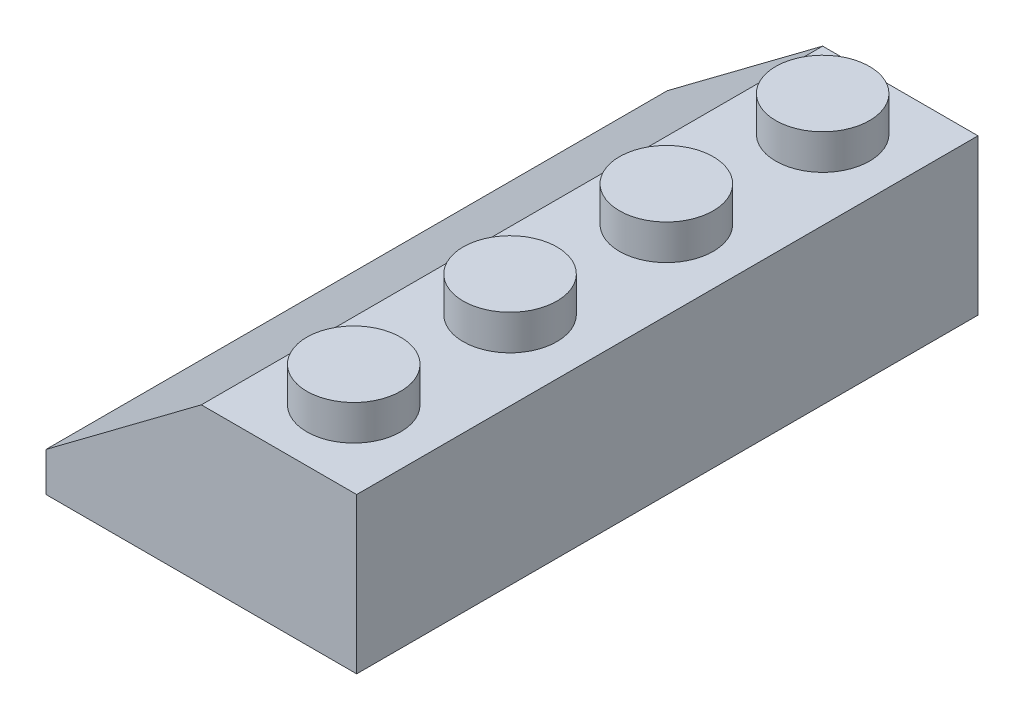
ISO-10303-21;
HEADER;
FILE_DESCRIPTION(('STEP AP214'),'2;1');
FILE_NAME('part.step','',(''),(''),'','','');
FILE_SCHEMA(('AUTOMOTIVE_DESIGN { 1 0 10303 214 1 1 1 1 }'));
ENDSEC;
DATA;
#1=APPLICATION_CONTEXT('core data for automotive mechanical design processes');
#2=APPLICATION_PROTOCOL_DEFINITION('international standard','automotive_design',2000,#1);
#3=PRODUCT_CONTEXT('',#1,'mechanical');
#4=PRODUCT('Part','Part','',(#3));
#5=PRODUCT_RELATED_PRODUCT_CATEGORY('part','',(#4));
#6=PRODUCT_DEFINITION_FORMATION('','',#4);
#7=PRODUCT_DEFINITION_CONTEXT('part definition',#1,'design');
#8=PRODUCT_DEFINITION('design','',#6,#7);
#9=PRODUCT_DEFINITION_SHAPE('','',#8);
#10=(LENGTH_UNIT() NAMED_UNIT(*) SI_UNIT(.MILLI.,.METRE.));
#11=(NAMED_UNIT(*) PLANE_ANGLE_UNIT() SI_UNIT($,.RADIAN.));
#12=(NAMED_UNIT(*) SI_UNIT($,.STERADIAN.) SOLID_ANGLE_UNIT());
#13=UNCERTAINTY_MEASURE_WITH_UNIT(LENGTH_MEASURE(1.E-05),#10,'distance_accuracy_value','');
#14=(GEOMETRIC_REPRESENTATION_CONTEXT(3) GLOBAL_UNCERTAINTY_ASSIGNED_CONTEXT((#13)) GLOBAL_UNIT_ASSIGNED_CONTEXT((#10,
#11,#12)) REPRESENTATION_CONTEXT('',''));
#15=CARTESIAN_POINT('',(0.,0.,0.));
#16=DIRECTION('',(0.,0.,1.));
#17=DIRECTION('',(1.,0.,0.));
#18=AXIS2_PLACEMENT_3D('',#15,#16,#17);
#19=CARTESIAN_POINT('',(0.,0.,-15.9));
#20=DIRECTION('',(0.,-1.,0.));
#21=DIRECTION('',(1.,0.,0.));
#22=AXIS2_PLACEMENT_3D('',#19,#20,#21);
#23=PLANE('',#22);
#24=DIRECTION('',(1.,0.,0.));
#25=VECTOR('',#24,1.);
#26=CARTESIAN_POINT('',(0.,0.,15.9));
#27=LINE('',#26,#25);
#28=CARTESIAN_POINT('',(-15.9,0.,15.9));
#29=VERTEX_POINT('',#28);
#30=CARTESIAN_POINT('',(0.,0.,15.9));
#31=VERTEX_POINT('',#30);
#32=EDGE_CURVE('E274',#29,#31,#27,.T.);
#33=ORIENTED_EDGE('',*,*,#32,.F.);
#34=DIRECTION('',(0.,0.,1.));
#35=VECTOR('',#34,1.);
#36=CARTESIAN_POINT('',(-15.9,0.,-15.9));
#37=LINE('',#36,#35);
#38=CARTESIAN_POINT('',(-15.9,0.,-15.9));
#39=VERTEX_POINT('',#38);
#40=EDGE_CURVE('E313',#39,#29,#37,.T.);
#41=ORIENTED_EDGE('',*,*,#40,.F.);
#42=DIRECTION('',(1.,0.,0.));
#43=VECTOR('',#42,1.);
#44=CARTESIAN_POINT('',(0.,0.,-15.9));
#45=LINE('',#44,#43);
#46=CARTESIAN_POINT('',(0.,0.,-15.9));
#47=VERTEX_POINT('',#46);
#48=EDGE_CURVE('E286',#39,#47,#45,.T.);
#49=ORIENTED_EDGE('',*,*,#48,.T.);
#50=DIRECTION('',(0.,0.,1.));
#51=VECTOR('',#50,1.);
#52=CARTESIAN_POINT('',(0.,0.,-15.9));
#53=LINE('',#52,#51);
#54=EDGE_CURVE('E309',#47,#31,#53,.T.);
#55=ORIENTED_EDGE('',*,*,#54,.T.);
#56=EDGE_LOOP('',(#33,#41,#49,#55));
#57=FACE_BOUND('',#56,.T.);
#58=DIRECTION('',(0.,0.,1.));
#59=VECTOR('',#58,1.);
#60=CARTESIAN_POINT('',(-14.7,0.,-15.9));
#61=LINE('',#60,#59);
#62=CARTESIAN_POINT('',(-14.7,0.,-14.7));
#63=VERTEX_POINT('',#62);
#64=CARTESIAN_POINT('',(-14.7,0.,14.7));
#65=VERTEX_POINT('',#64);
#66=EDGE_CURVE('E231',#63,#65,#61,.T.);
#67=ORIENTED_EDGE('',*,*,#66,.T.);
#68=DIRECTION('',(1.,0.,0.));
#69=VECTOR('',#68,1.);
#70=CARTESIAN_POINT('',(0.,0.,14.7));
#71=LINE('',#70,#69);
#72=CARTESIAN_POINT('',(-1.2,0.,14.7));
#73=VERTEX_POINT('',#72);
#74=EDGE_CURVE('E212',#65,#73,#71,.T.);
#75=ORIENTED_EDGE('',*,*,#74,.T.);
#76=DIRECTION('',(0.,0.,1.));
#77=VECTOR('',#76,1.);
#78=CARTESIAN_POINT('',(-1.2,0.,-15.9));
#79=LINE('',#78,#77);
#80=CARTESIAN_POINT('',(-1.2,0.,-14.7));
#81=VERTEX_POINT('',#80);
#82=EDGE_CURVE('E244',#81,#73,#79,.T.);
#83=ORIENTED_EDGE('',*,*,#82,.F.);
#84=DIRECTION('',(1.,0.,0.));
#85=VECTOR('',#84,1.);
#86=CARTESIAN_POINT('',(0.,0.,-14.7));
#87=LINE('',#86,#85);
#88=EDGE_CURVE('E190',#63,#81,#87,.T.);
#89=ORIENTED_EDGE('',*,*,#88,.F.);
#90=EDGE_LOOP('',(#67,#75,#83,#89));
#91=FACE_BOUND('',#90,.T.);
#92=ADVANCED_FACE('F41',(#57,#91),#23,.T.);
#93=CARTESIAN_POINT('',(-4.05,9.75,-12.));
#94=DIRECTION('',(0.,1.,0.));
#95=DIRECTION('',(0.,0.,1.));
#96=AXIS2_PLACEMENT_3D('',#93,#94,#95);
#97=PLANE('',#96);
#98=CARTESIAN_POINT('',(-4.05,9.75,-12.));
#99=DIRECTION('',(0.,1.,0.));
#100=DIRECTION('',(0.,0.,1.));
#101=AXIS2_PLACEMENT_3D('',#98,#99,#100);
#102=CIRCLE('',#101,2.4);
#103=CARTESIAN_POINT('',(-4.05,9.75,-9.6));
#104=VERTEX_POINT('',#103);
#105=EDGE_CURVE('E11',#104,#104,#102,.T.);
#106=ORIENTED_EDGE('',*,*,#105,.T.);
#107=EDGE_LOOP('',(#106));
#108=FACE_BOUND('',#107,.T.);
#109=ADVANCED_FACE('F43',(#108),#97,.T.);
#110=CARTESIAN_POINT('',(-4.05,9.75,-12.));
#111=DIRECTION('',(0.,-1.,0.));
#112=DIRECTION('',(0.,0.,-1.));
#113=AXIS2_PLACEMENT_3D('',#110,#111,#112);
#114=CYLINDRICAL_SURFACE('',#113,2.4);
#115=ORIENTED_EDGE('',*,*,#105,.F.);
#116=EDGE_LOOP('',(#115));
#117=FACE_BOUND('',#116,.T.);
#118=CARTESIAN_POINT('',(-4.05,7.95,-12.));
#119=DIRECTION('',(0.,1.,0.));
#120=DIRECTION('',(0.,0.,1.));
#121=AXIS2_PLACEMENT_3D('',#118,#119,#120);
#122=CIRCLE('',#121,2.4);
#123=CARTESIAN_POINT('',(-4.05,7.95,-9.6));
#124=VERTEX_POINT('',#123);
#125=EDGE_CURVE('E50',#124,#124,#122,.T.);
#126=ORIENTED_EDGE('',*,*,#125,.T.);
#127=EDGE_LOOP('',(#126));
#128=FACE_BOUND('',#127,.T.);
#129=ADVANCED_FACE('F334',(#117,#128),#114,.T.);
#130=CARTESIAN_POINT('',(-4.05,9.75,-4.));
#131=DIRECTION('',(0.,1.,0.));
#132=DIRECTION('',(0.,0.,1.));
#133=AXIS2_PLACEMENT_3D('',#130,#131,#132);
#134=PLANE('',#133);
#135=CARTESIAN_POINT('',(-4.05,9.75,-4.));
#136=DIRECTION('',(0.,1.,0.));
#137=DIRECTION('',(0.,0.,1.));
#138=AXIS2_PLACEMENT_3D('',#135,#136,#137);
#139=CIRCLE('',#138,2.4);
#140=CARTESIAN_POINT('',(-4.05,9.75,-1.6));
#141=VERTEX_POINT('',#140);
#142=EDGE_CURVE('E327',#141,#141,#139,.T.);
#143=ORIENTED_EDGE('',*,*,#142,.T.);
#144=EDGE_LOOP('',(#143));
#145=FACE_BOUND('',#144,.T.);
#146=ADVANCED_FACE('F389',(#145),#134,.T.);
#147=CARTESIAN_POINT('',(-4.05,9.75,-4.));
#148=DIRECTION('',(0.,-1.,0.));
#149=DIRECTION('',(0.,0.,-1.));
#150=AXIS2_PLACEMENT_3D('',#147,#148,#149);
#151=CYLINDRICAL_SURFACE('',#150,2.4);
#152=ORIENTED_EDGE('',*,*,#142,.F.);
#153=EDGE_LOOP('',(#152));
#154=FACE_BOUND('',#153,.T.);
#155=CARTESIAN_POINT('',(-4.05,7.95,-4.));
#156=DIRECTION('',(0.,1.,0.));
#157=DIRECTION('',(0.,0.,1.));
#158=AXIS2_PLACEMENT_3D('',#155,#156,#157);
#159=CIRCLE('',#158,2.4);
#160=CARTESIAN_POINT('',(-4.05,7.95,-1.6));
#161=VERTEX_POINT('',#160);
#162=EDGE_CURVE('E312',#161,#161,#159,.T.);
#163=ORIENTED_EDGE('',*,*,#162,.T.);
#164=EDGE_LOOP('',(#163));
#165=FACE_BOUND('',#164,.T.);
#166=ADVANCED_FACE('F372',(#154,#165),#151,.T.);
#167=CARTESIAN_POINT('',(0.,7.95,-15.9));
#168=DIRECTION('',(1.,0.,0.));
#169=DIRECTION('',(0.,1.,0.));
#170=AXIS2_PLACEMENT_3D('',#167,#168,#169);
#171=PLANE('',#170);
#172=DIRECTION('',(0.,1.,0.));
#173=VECTOR('',#172,1.);
#174=CARTESIAN_POINT('',(0.,7.95,15.9));
#175=LINE('',#174,#173);
#176=CARTESIAN_POINT('',(0.,7.95,15.9));
#177=VERTEX_POINT('',#176);
#178=EDGE_CURVE('E265',#31,#177,#175,.T.);
#179=ORIENTED_EDGE('',*,*,#178,.F.);
#180=ORIENTED_EDGE('',*,*,#54,.F.);
#181=DIRECTION('',(0.,1.,0.));
#182=VECTOR('',#181,1.);
#183=CARTESIAN_POINT('',(0.,7.95,-15.9));
#184=LINE('',#183,#182);
#185=CARTESIAN_POINT('',(0.,7.95,-15.9));
#186=VERTEX_POINT('',#185);
#187=EDGE_CURVE('E269',#47,#186,#184,.T.);
#188=ORIENTED_EDGE('',*,*,#187,.T.);
#189=DIRECTION('',(0.,0.,1.));
#190=VECTOR('',#189,1.);
#191=CARTESIAN_POINT('',(0.,7.95,-15.9));
#192=LINE('',#191,#190);
#193=EDGE_CURVE('E290',#186,#177,#192,.T.);
#194=ORIENTED_EDGE('',*,*,#193,.T.);
#195=EDGE_LOOP('',(#179,#180,#188,#194));
#196=FACE_BOUND('',#195,.T.);
#197=ADVANCED_FACE('F367',(#196),#171,.T.);
#198=CARTESIAN_POINT('',(-15.9,0.,-15.9));
#199=DIRECTION('',(-1.,0.,0.));
#200=DIRECTION('',(0.,0.,1.));
#201=AXIS2_PLACEMENT_3D('',#198,#199,#200);
#202=PLANE('',#201);
#203=DIRECTION('',(0.,-1.,0.));
#204=VECTOR('',#203,1.);
#205=CARTESIAN_POINT('',(-15.9,0.,15.9));
#206=LINE('',#205,#204);
#207=CARTESIAN_POINT('',(-15.9,2.,15.9));
#208=VERTEX_POINT('',#207);
#209=EDGE_CURVE('E302',#208,#29,#206,.T.);
#210=ORIENTED_EDGE('',*,*,#209,.F.);
#211=DIRECTION('',(0.,0.,1.));
#212=VECTOR('',#211,1.);
#213=CARTESIAN_POINT('',(-15.9,2.,-15.9));
#214=LINE('',#213,#212);
#215=CARTESIAN_POINT('',(-15.9,2.,-15.9));
#216=VERTEX_POINT('',#215);
#217=EDGE_CURVE('E316',#216,#208,#214,.T.);
#218=ORIENTED_EDGE('',*,*,#217,.F.);
#219=DIRECTION('',(0.,-1.,0.));
#220=VECTOR('',#219,1.);
#221=CARTESIAN_POINT('',(-15.9,0.,-15.9));
#222=LINE('',#221,#220);
#223=EDGE_CURVE('E282',#216,#39,#222,.T.);
#224=ORIENTED_EDGE('',*,*,#223,.T.);
#225=ORIENTED_EDGE('',*,*,#40,.T.);
#226=EDGE_LOOP('',(#210,#218,#224,#225));
#227=FACE_BOUND('',#226,.T.);
#228=ADVANCED_FACE('F349',(#227),#202,.T.);
#229=CARTESIAN_POINT('',(-15.9,2.,-15.9));
#230=DIRECTION('',(-0.599194056687901,0.800603823641816,0.));
#231=DIRECTION('',(-0.800603823641816,-0.599194056687901,0.));
#232=AXIS2_PLACEMENT_3D('',#229,#230,#231);
#233=PLANE('',#232);
#234=DIRECTION('',(-0.800603823641816,-0.599194056687901,0.));
#235=VECTOR('',#234,1.);
#236=CARTESIAN_POINT('',(-15.9,2.,15.9));
#237=LINE('',#236,#235);
#238=CARTESIAN_POINT('',(-7.95,7.95,15.9));
#239=VERTEX_POINT('',#238);
#240=EDGE_CURVE('E298',#239,#208,#237,.T.);
#241=ORIENTED_EDGE('',*,*,#240,.F.);
#242=DIRECTION('',(0.,0.,1.));
#243=VECTOR('',#242,1.);
#244=CARTESIAN_POINT('',(-7.95,7.95,-15.9));
#245=LINE('',#244,#243);
#246=CARTESIAN_POINT('',(-7.95,7.95,-15.9));
#247=VERTEX_POINT('',#246);
#248=EDGE_CURVE('E319',#247,#239,#245,.T.);
#249=ORIENTED_EDGE('',*,*,#248,.F.);
#250=DIRECTION('',(-0.800603823641816,-0.599194056687901,0.));
#251=VECTOR('',#250,1.);
#252=CARTESIAN_POINT('',(-15.9,2.,-15.9));
#253=LINE('',#252,#251);
#254=EDGE_CURVE('E278',#247,#216,#253,.T.);
#255=ORIENTED_EDGE('',*,*,#254,.T.);
#256=ORIENTED_EDGE('',*,*,#217,.T.);
#257=EDGE_LOOP('',(#241,#249,#255,#256));
#258=FACE_BOUND('',#257,.T.);
#259=ADVANCED_FACE('F339',(#258),#233,.T.);
#260=CARTESIAN_POINT('',(-7.95,7.95,-15.9));
#261=DIRECTION('',(0.,1.,0.));
#262=DIRECTION('',(0.,0.,1.));
#263=AXIS2_PLACEMENT_3D('',#260,#261,#262);
#264=PLANE('',#263);
#265=CARTESIAN_POINT('',(-4.05,7.95,4.));
#266=DIRECTION('',(0.,1.,0.));
#267=DIRECTION('',(0.,0.,1.));
#268=AXIS2_PLACEMENT_3D('',#265,#266,#267);
#269=CIRCLE('',#268,2.4);
#270=CARTESIAN_POINT('',(-4.05,7.95,6.4));
#271=VERTEX_POINT('',#270);
#272=EDGE_CURVE('E251',#271,#271,#269,.T.);
#273=ORIENTED_EDGE('',*,*,#272,.F.);
#274=EDGE_LOOP('',(#273));
#275=FACE_BOUND('',#274,.T.);
#276=CARTESIAN_POINT('',(-4.05,7.95,12.));
#277=DIRECTION('',(0.,1.,0.));
#278=DIRECTION('',(0.,0.,1.));
#279=AXIS2_PLACEMENT_3D('',#276,#277,#278);
#280=CIRCLE('',#279,2.4);
#281=CARTESIAN_POINT('',(-4.05,7.95,14.4));
#282=VERTEX_POINT('',#281);
#283=EDGE_CURVE('E260',#282,#282,#280,.T.);
#284=ORIENTED_EDGE('',*,*,#283,.F.);
#285=EDGE_LOOP('',(#284));
#286=FACE_BOUND('',#285,.T.);
#287=DIRECTION('',(-1.,0.,0.));
#288=VECTOR('',#287,1.);
#289=CARTESIAN_POINT('',(-7.95,7.95,15.9));
#290=LINE('',#289,#288);
#291=EDGE_CURVE('E294',#177,#239,#290,.T.);
#292=ORIENTED_EDGE('',*,*,#291,.F.);
#293=ORIENTED_EDGE('',*,*,#193,.F.);
#294=DIRECTION('',(-1.,0.,0.));
#295=VECTOR('',#294,1.);
#296=CARTESIAN_POINT('',(-7.95,7.95,-15.9));
#297=LINE('',#296,#295);
#298=EDGE_CURVE('E273',#186,#247,#297,.T.);
#299=ORIENTED_EDGE('',*,*,#298,.T.);
#300=ORIENTED_EDGE('',*,*,#248,.T.);
#301=EDGE_LOOP('',(#292,#293,#299,#300));
#302=FACE_BOUND('',#301,.T.);
#303=ORIENTED_EDGE('',*,*,#162,.F.);
#304=EDGE_LOOP('',(#303));
#305=FACE_BOUND('',#304,.T.);
#306=ORIENTED_EDGE('',*,*,#125,.F.);
#307=EDGE_LOOP('',(#306));
#308=FACE_BOUND('',#307,.T.);
#309=ADVANCED_FACE('F336',(#275,#286,#302,#305,#308),#264,.T.);
#310=CARTESIAN_POINT('',(0.,0.,-15.9));
#311=DIRECTION('',(0.,0.,-1.));
#312=DIRECTION('',(-1.,0.,0.));
#313=AXIS2_PLACEMENT_3D('',#310,#311,#312);
#314=PLANE('',#313);
#315=ORIENTED_EDGE('',*,*,#187,.F.);
#316=ORIENTED_EDGE('',*,*,#48,.F.);
#317=ORIENTED_EDGE('',*,*,#223,.F.);
#318=ORIENTED_EDGE('',*,*,#254,.F.);
#319=ORIENTED_EDGE('',*,*,#298,.F.);
#320=EDGE_LOOP('',(#315,#316,#317,#318,#319));
#321=FACE_BOUND('',#320,.T.);
#322=ADVANCED_FACE('F338',(#321),#314,.T.);
#323=CARTESIAN_POINT('',(0.,0.,15.9));
#324=DIRECTION('',(0.,0.,-1.));
#325=DIRECTION('',(-1.,0.,0.));
#326=AXIS2_PLACEMENT_3D('',#323,#324,#325);
#327=PLANE('',#326);
#328=ORIENTED_EDGE('',*,*,#178,.T.);
#329=ORIENTED_EDGE('',*,*,#291,.T.);
#330=ORIENTED_EDGE('',*,*,#240,.T.);
#331=ORIENTED_EDGE('',*,*,#209,.T.);
#332=ORIENTED_EDGE('',*,*,#32,.T.);
#333=EDGE_LOOP('',(#328,#329,#330,#331,#332));
#334=FACE_BOUND('',#333,.T.);
#335=ADVANCED_FACE('F346',(#334),#327,.F.);
#336=CARTESIAN_POINT('',(-4.05,9.75,12.));
#337=DIRECTION('',(0.,-1.,0.));
#338=DIRECTION('',(0.,0.,-1.));
#339=AXIS2_PLACEMENT_3D('',#336,#337,#338);
#340=CYLINDRICAL_SURFACE('',#339,2.4);
#341=CARTESIAN_POINT('',(-4.05,9.75,12.));
#342=DIRECTION('',(0.,1.,0.));
#343=DIRECTION('',(0.,0.,1.));
#344=AXIS2_PLACEMENT_3D('',#341,#342,#343);
#345=CIRCLE('',#344,2.4);
#346=CARTESIAN_POINT('',(-4.05,9.75,14.4));
#347=VERTEX_POINT('',#346);
#348=EDGE_CURVE('E261',#347,#347,#345,.T.);
#349=ORIENTED_EDGE('',*,*,#348,.F.);
#350=EDGE_LOOP('',(#349));
#351=FACE_BOUND('',#350,.T.);
#352=ORIENTED_EDGE('',*,*,#283,.T.);
#353=EDGE_LOOP('',(#352));
#354=FACE_BOUND('',#353,.T.);
#355=ADVANCED_FACE('F754',(#351,#354),#340,.T.);
#356=CARTESIAN_POINT('',(-4.05,9.75,12.));
#357=DIRECTION('',(0.,1.,0.));
#358=DIRECTION('',(0.,0.,1.));
#359=AXIS2_PLACEMENT_3D('',#356,#357,#358);
#360=PLANE('',#359);
#361=ORIENTED_EDGE('',*,*,#348,.T.);
#362=EDGE_LOOP('',(#361));
#363=FACE_BOUND('',#362,.T.);
#364=ADVANCED_FACE('F430',(#363),#360,.T.);
#365=CARTESIAN_POINT('',(-4.05,9.75,4.));
#366=DIRECTION('',(0.,-1.,0.));
#367=DIRECTION('',(0.,0.,-1.));
#368=AXIS2_PLACEMENT_3D('',#365,#366,#367);
#369=CYLINDRICAL_SURFACE('',#368,2.4);
#370=CARTESIAN_POINT('',(-4.05,9.75,4.));
#371=DIRECTION('',(0.,1.,0.));
#372=DIRECTION('',(0.,0.,1.));
#373=AXIS2_PLACEMENT_3D('',#370,#371,#372);
#374=CIRCLE('',#373,2.4);
#375=CARTESIAN_POINT('',(-4.05,9.75,6.4));
#376=VERTEX_POINT('',#375);
#377=EDGE_CURVE('E255',#376,#376,#374,.T.);
#378=ORIENTED_EDGE('',*,*,#377,.F.);
#379=EDGE_LOOP('',(#378));
#380=FACE_BOUND('',#379,.T.);
#381=ORIENTED_EDGE('',*,*,#272,.T.);
#382=EDGE_LOOP('',(#381));
#383=FACE_BOUND('',#382,.T.);
#384=ADVANCED_FACE('F425',(#380,#383),#369,.T.);
#385=CARTESIAN_POINT('',(-4.05,9.75,4.));
#386=DIRECTION('',(0.,1.,0.));
#387=DIRECTION('',(0.,0.,1.));
#388=AXIS2_PLACEMENT_3D('',#385,#386,#387);
#389=PLANE('',#388);
#390=ORIENTED_EDGE('',*,*,#377,.T.);
#391=EDGE_LOOP('',(#390));
#392=FACE_BOUND('',#391,.T.);
#393=ADVANCED_FACE('F429',(#392),#389,.T.);
#394=CARTESIAN_POINT('',(-4.05,8.55,-12.));
#395=DIRECTION('',(0.,1.,0.));
#396=DIRECTION('',(0.,0.,1.));
#397=AXIS2_PLACEMENT_3D('',#394,#395,#396);
#398=PLANE('',#397);
#399=CARTESIAN_POINT('',(-4.05,8.55,-12.));
#400=DIRECTION('',(0.,1.,0.));
#401=DIRECTION('',(0.,0.,1.));
#402=AXIS2_PLACEMENT_3D('',#399,#400,#401);
#403=CIRCLE('',#402,1.2);
#404=CARTESIAN_POINT('',(-4.05,8.55,-10.8));
#405=VERTEX_POINT('',#404);
#406=EDGE_CURVE('E256',#405,#405,#403,.T.);
#407=ORIENTED_EDGE('',*,*,#406,.F.);
#408=EDGE_LOOP('',(#407));
#409=FACE_BOUND('',#408,.T.);
#410=ADVANCED_FACE('F440',(#409),#398,.F.);
#411=CARTESIAN_POINT('',(-4.05,9.75,-12.));
#412=DIRECTION('',(0.,-1.,0.));
#413=DIRECTION('',(0.,0.,-1.));
#414=AXIS2_PLACEMENT_3D('',#411,#412,#413);
#415=CYLINDRICAL_SURFACE('',#414,1.2);
#416=ORIENTED_EDGE('',*,*,#406,.T.);
#417=EDGE_LOOP('',(#416));
#418=FACE_BOUND('',#417,.T.);
#419=CARTESIAN_POINT('',(-4.05,6.75,-12.));
#420=DIRECTION('',(0.,1.,0.));
#421=DIRECTION('',(0.,0.,1.));
#422=AXIS2_PLACEMENT_3D('',#419,#420,#421);
#423=CIRCLE('',#422,1.2);
#424=CARTESIAN_POINT('',(-4.05,6.75,-10.8));
#425=VERTEX_POINT('',#424);
#426=EDGE_CURVE('E849',#425,#425,#423,.T.);
#427=ORIENTED_EDGE('',*,*,#426,.F.);
#428=EDGE_LOOP('',(#427));
#429=FACE_BOUND('',#428,.T.);
#430=ADVANCED_FACE('F455',(#418,#429),#415,.F.);
#431=CARTESIAN_POINT('',(-4.05,8.55,-4.));
#432=DIRECTION('',(0.,1.,0.));
#433=DIRECTION('',(0.,0.,1.));
#434=AXIS2_PLACEMENT_3D('',#431,#432,#433);
#435=PLANE('',#434);
#436=CARTESIAN_POINT('',(-4.05,8.55,-4.));
#437=DIRECTION('',(0.,1.,0.));
#438=DIRECTION('',(0.,0.,1.));
#439=AXIS2_PLACEMENT_3D('',#436,#437,#438);
#440=CIRCLE('',#439,1.2);
#441=CARTESIAN_POINT('',(-4.05,8.55,-2.8));
#442=VERTEX_POINT('',#441);
#443=EDGE_CURVE('E853',#442,#442,#440,.T.);
#444=ORIENTED_EDGE('',*,*,#443,.F.);
#445=EDGE_LOOP('',(#444));
#446=FACE_BOUND('',#445,.T.);
#447=ADVANCED_FACE('F465',(#446),#435,.F.);
#448=CARTESIAN_POINT('',(-4.05,9.75,-4.));
#449=DIRECTION('',(0.,-1.,0.));
#450=DIRECTION('',(0.,0.,-1.));
#451=AXIS2_PLACEMENT_3D('',#448,#449,#450);
#452=CYLINDRICAL_SURFACE('',#451,1.2);
#453=ORIENTED_EDGE('',*,*,#443,.T.);
#454=EDGE_LOOP('',(#453));
#455=FACE_BOUND('',#454,.T.);
#456=CARTESIAN_POINT('',(-4.05,6.75,-4.));
#457=DIRECTION('',(0.,1.,0.));
#458=DIRECTION('',(0.,0.,1.));
#459=AXIS2_PLACEMENT_3D('',#456,#457,#458);
#460=CIRCLE('',#459,1.2);
#461=CARTESIAN_POINT('',(-4.05,6.75,-2.8));
#462=VERTEX_POINT('',#461);
#463=EDGE_CURVE('E246',#462,#462,#460,.T.);
#464=ORIENTED_EDGE('',*,*,#463,.F.);
#465=EDGE_LOOP('',(#464));
#466=FACE_BOUND('',#465,.T.);
#467=ADVANCED_FACE('F475',(#455,#466),#452,.F.);
#468=CARTESIAN_POINT('',(-1.2,7.95,-15.9));
#469=DIRECTION('',(1.,0.,0.));
#470=DIRECTION('',(0.,1.,0.));
#471=AXIS2_PLACEMENT_3D('',#468,#469,#470);
#472=PLANE('',#471);
#473=DIRECTION('',(0.,1.,0.));
#474=VECTOR('',#473,1.);
#475=CARTESIAN_POINT('',(-1.2,7.95,14.7));
#476=LINE('',#475,#474);
#477=CARTESIAN_POINT('',(-1.2,6.75,14.7));
#478=VERTEX_POINT('',#477);
#479=EDGE_CURVE('E221',#73,#478,#476,.T.);
#480=ORIENTED_EDGE('',*,*,#479,.T.);
#481=DIRECTION('',(0.,0.,1.));
#482=VECTOR('',#481,1.);
#483=CARTESIAN_POINT('',(-1.2,6.75,-15.9));
#484=LINE('',#483,#482);
#485=CARTESIAN_POINT('',(-1.2,6.75,-14.7));
#486=VERTEX_POINT('',#485);
#487=EDGE_CURVE('E181',#486,#478,#484,.T.);
#488=ORIENTED_EDGE('',*,*,#487,.F.);
#489=DIRECTION('',(0.,1.,0.));
#490=VECTOR('',#489,1.);
#491=CARTESIAN_POINT('',(-1.2,7.95,-14.7));
#492=LINE('',#491,#490);
#493=EDGE_CURVE('E205',#81,#486,#492,.T.);
#494=ORIENTED_EDGE('',*,*,#493,.F.);
#495=ORIENTED_EDGE('',*,*,#82,.T.);
#496=EDGE_LOOP('',(#480,#488,#494,#495));
#497=FACE_BOUND('',#496,.T.);
#498=ADVANCED_FACE('F485',(#497),#472,.F.);
#499=CARTESIAN_POINT('',(-14.7,0.,-15.9));
#500=DIRECTION('',(-1.,0.,0.));
#501=DIRECTION('',(0.,0.,1.));
#502=AXIS2_PLACEMENT_3D('',#499,#500,#501);
#503=PLANE('',#502);
#504=DIRECTION('',(0.,-1.,0.));
#505=VECTOR('',#504,1.);
#506=CARTESIAN_POINT('',(-14.7,0.,14.7));
#507=LINE('',#506,#505);
#508=CARTESIAN_POINT('',(-14.7,1.39924452298182,14.7));
#509=VERTEX_POINT('',#508);
#510=EDGE_CURVE('E217',#509,#65,#507,.T.);
#511=ORIENTED_EDGE('',*,*,#510,.T.);
#512=ORIENTED_EDGE('',*,*,#66,.F.);
#513=DIRECTION('',(0.,-1.,0.));
#514=VECTOR('',#513,1.);
#515=CARTESIAN_POINT('',(-14.7,0.,-14.7));
#516=LINE('',#515,#514);
#517=CARTESIAN_POINT('',(-14.7,1.39924452298182,-14.7));
#518=VERTEX_POINT('',#517);
#519=EDGE_CURVE('E196',#518,#63,#516,.T.);
#520=ORIENTED_EDGE('',*,*,#519,.F.);
#521=DIRECTION('',(0.,0.,1.));
#522=VECTOR('',#521,1.);
#523=CARTESIAN_POINT('',(-14.7,1.39924452298182,-15.9));
#524=LINE('',#523,#522);
#525=EDGE_CURVE('E175',#518,#509,#524,.T.);
#526=ORIENTED_EDGE('',*,*,#525,.T.);
#527=EDGE_LOOP('',(#511,#512,#520,#526));
#528=FACE_BOUND('',#527,.T.);
#529=ADVANCED_FACE('F495',(#528),#503,.F.);
#530=CARTESIAN_POINT('',(-15.1809671319745,1.03927541162982,-15.9));
#531=DIRECTION('',(-0.599194056687901,0.800603823641816,0.));
#532=DIRECTION('',(-0.800603823641816,-0.599194056687901,0.));
#533=AXIS2_PLACEMENT_3D('',#530,#531,#532);
#534=PLANE('',#533);
#535=CARTESIAN_POINT('',(-8.01540146193957,6.40218305146729,-8.));
#536=DIRECTION('',(-0.599194056687901,0.800603823641816,0.));
#537=DIRECTION('',(0.800603823641816,0.599194056687901,0.));
#538=AXIS2_PLACEMENT_3D('',#535,#536,#537);
#539=ELLIPSE('',#538,4.05943602069783,3.25);
#540=CARTESIAN_POINT('',(-7.55067125339588,6.75,-4.78339840308643));
#541=VERTEX_POINT('',#540);
#542=CARTESIAN_POINT('',(-7.55067125339588,6.75,-11.2166015969136));
#543=VERTEX_POINT('',#542);
#544=EDGE_CURVE('E164',#541,#543,#539,.F.);
#545=ORIENTED_EDGE('',*,*,#544,.F.);
#546=DIRECTION('',(0.,0.,1.));
#547=VECTOR('',#546,1.);
#548=CARTESIAN_POINT('',(-7.55067125339588,6.75,-15.9));
#549=LINE('',#548,#547);
#550=CARTESIAN_POINT('',(-7.55067125339588,6.75,-3.21660159691357));
#551=VERTEX_POINT('',#550);
#552=EDGE_CURVE('E170',#541,#551,#549,.T.);
#553=ORIENTED_EDGE('',*,*,#552,.T.);
#554=CARTESIAN_POINT('',(-8.01540146193957,6.40218305146729,0.));
#555=DIRECTION('',(-0.599194056687901,0.800603823641816,0.));
#556=DIRECTION('',(0.800603823641816,0.599194056687901,0.));
#557=AXIS2_PLACEMENT_3D('',#554,#555,#556);
#558=ELLIPSE('',#557,4.05943602069783,3.25);
#559=CARTESIAN_POINT('',(-7.55067125339588,6.75,3.21660159691357));
#560=VERTEX_POINT('',#559);
#561=EDGE_CURVE('E842',#560,#551,#558,.F.);
#562=ORIENTED_EDGE('',*,*,#561,.F.);
#563=CARTESIAN_POINT('',(-7.55067125339588,6.75,4.78339840308643));
#564=VERTEX_POINT('',#563);
#565=EDGE_CURVE('E189',#560,#564,#549,.T.);
#566=ORIENTED_EDGE('',*,*,#565,.T.);
#567=CARTESIAN_POINT('',(-8.01540146193957,6.40218305146729,8.));
#568=DIRECTION('',(-0.599194056687901,0.800603823641816,0.));
#569=DIRECTION('',(0.800603823641816,0.599194056687901,0.));
#570=AXIS2_PLACEMENT_3D('',#567,#568,#569);
#571=ELLIPSE('',#570,4.05943602069783,3.25);
#572=CARTESIAN_POINT('',(-7.55067125339588,6.75,11.2166015969136));
#573=VERTEX_POINT('',#572);
#574=EDGE_CURVE('E818',#573,#564,#571,.F.);
#575=ORIENTED_EDGE('',*,*,#574,.F.);
#576=CARTESIAN_POINT('',(-7.55067125339588,6.75,14.7));
#577=VERTEX_POINT('',#576);
#578=EDGE_CURVE('E172',#573,#577,#549,.T.);
#579=ORIENTED_EDGE('',*,*,#578,.T.);
#580=DIRECTION('',(-0.800603823641816,-0.599194056687901,0.));
#581=VECTOR('',#580,1.);
#582=CARTESIAN_POINT('',(-15.1809671319745,1.03927541162982,14.7));
#583=LINE('',#582,#581);
#584=EDGE_CURVE('E228',#577,#509,#583,.T.);
#585=ORIENTED_EDGE('',*,*,#584,.T.);
#586=ORIENTED_EDGE('',*,*,#525,.F.);
#587=DIRECTION('',(-0.800603823641816,-0.599194056687901,0.));
#588=VECTOR('',#587,1.);
#589=CARTESIAN_POINT('',(-15.1809671319745,1.03927541162982,-14.7));
#590=LINE('',#589,#588);
#591=CARTESIAN_POINT('',(-7.55067125339588,6.75,-14.7));
#592=VERTEX_POINT('',#591);
#593=EDGE_CURVE('E204',#592,#518,#590,.T.);
#594=ORIENTED_EDGE('',*,*,#593,.F.);
#595=EDGE_CURVE('E169',#592,#543,#549,.T.);
#596=ORIENTED_EDGE('',*,*,#595,.T.);
#597=EDGE_LOOP('',(#545,#553,#562,#566,#575,#579,#585,#586,#594,#596));
#598=FACE_BOUND('',#597,.T.);
#599=ADVANCED_FACE('F505',(#598),#534,.F.);
#600=CARTESIAN_POINT('',(-7.95,6.75,-15.9));
#601=DIRECTION('',(0.,1.,0.));
#602=DIRECTION('',(0.,0.,1.));
#603=AXIS2_PLACEMENT_3D('',#600,#601,#602);
#604=PLANE('',#603);
#605=CARTESIAN_POINT('',(-8.01540146193957,6.75,-8.));
#606=DIRECTION('',(0.,-1.,0.));
#607=DIRECTION('',(0.,0.,-1.));
#608=AXIS2_PLACEMENT_3D('',#605,#606,#607);
#609=CIRCLE('',#608,3.25);
#610=EDGE_CURVE('E64',#543,#541,#609,.T.);
#611=ORIENTED_EDGE('',*,*,#610,.F.);
#612=ORIENTED_EDGE('',*,*,#595,.F.);
#613=DIRECTION('',(-1.,0.,0.));
#614=VECTOR('',#613,1.);
#615=CARTESIAN_POINT('',(-7.95,6.75,-14.7));
#616=LINE('',#615,#614);
#617=EDGE_CURVE('E201',#486,#592,#616,.T.);
#618=ORIENTED_EDGE('',*,*,#617,.F.);
#619=ORIENTED_EDGE('',*,*,#487,.T.);
#620=DIRECTION('',(-1.,0.,0.));
#621=VECTOR('',#620,1.);
#622=CARTESIAN_POINT('',(-7.95,6.75,14.7));
#623=LINE('',#622,#621);
#624=EDGE_CURVE('E199',#478,#577,#623,.T.);
#625=ORIENTED_EDGE('',*,*,#624,.T.);
#626=ORIENTED_EDGE('',*,*,#578,.F.);
#627=CARTESIAN_POINT('',(-8.01540146193957,6.75,8.));
#628=DIRECTION('',(0.,-1.,0.));
#629=DIRECTION('',(0.,0.,-1.));
#630=AXIS2_PLACEMENT_3D('',#627,#628,#629);
#631=CIRCLE('',#630,3.25);
#632=EDGE_CURVE('E804',#564,#573,#631,.T.);
#633=ORIENTED_EDGE('',*,*,#632,.F.);
#634=ORIENTED_EDGE('',*,*,#565,.F.);
#635=CARTESIAN_POINT('',(-8.01540146193957,6.75,0.));
#636=DIRECTION('',(0.,-1.,0.));
#637=DIRECTION('',(0.,0.,-1.));
#638=AXIS2_PLACEMENT_3D('',#635,#636,#637);
#639=CIRCLE('',#638,3.25);
#640=EDGE_CURVE('E828',#551,#560,#639,.T.);
#641=ORIENTED_EDGE('',*,*,#640,.F.);
#642=ORIENTED_EDGE('',*,*,#552,.F.);
#643=EDGE_LOOP('',(#611,#612,#618,#619,#625,#626,#633,#634,#641,#642));
#644=FACE_BOUND('',#643,.T.);
#645=CARTESIAN_POINT('',(-4.05,6.75,4.));
#646=DIRECTION('',(0.,1.,0.));
#647=DIRECTION('',(0.,0.,1.));
#648=AXIS2_PLACEMENT_3D('',#645,#646,#647);
#649=CIRCLE('',#648,1.2);
#650=CARTESIAN_POINT('',(-4.05,6.75,5.2));
#651=VERTEX_POINT('',#650);
#652=EDGE_CURVE('E243',#651,#651,#649,.T.);
#653=ORIENTED_EDGE('',*,*,#652,.T.);
#654=EDGE_LOOP('',(#653));
#655=FACE_BOUND('',#654,.T.);
#656=CARTESIAN_POINT('',(-4.05,6.75,12.));
#657=DIRECTION('',(0.,1.,0.));
#658=DIRECTION('',(0.,0.,1.));
#659=AXIS2_PLACEMENT_3D('',#656,#657,#658);
#660=CIRCLE('',#659,1.2);
#661=CARTESIAN_POINT('',(-4.05,6.75,13.2));
#662=VERTEX_POINT('',#661);
#663=EDGE_CURVE('E238',#662,#662,#660,.T.);
#664=ORIENTED_EDGE('',*,*,#663,.T.);
#665=EDGE_LOOP('',(#664));
#666=FACE_BOUND('',#665,.T.);
#667=ORIENTED_EDGE('',*,*,#463,.T.);
#668=EDGE_LOOP('',(#667));
#669=FACE_BOUND('',#668,.T.);
#670=ORIENTED_EDGE('',*,*,#426,.T.);
#671=EDGE_LOOP('',(#670));
#672=FACE_BOUND('',#671,.T.);
#673=ADVANCED_FACE('F519',(#644,#655,#666,#669,#672),#604,.F.);
#674=CARTESIAN_POINT('',(0.,0.,-14.7));
#675=DIRECTION('',(0.,0.,-1.));
#676=DIRECTION('',(-1.,0.,0.));
#677=AXIS2_PLACEMENT_3D('',#674,#675,#676);
#678=PLANE('',#677);
#679=ORIENTED_EDGE('',*,*,#493,.T.);
#680=ORIENTED_EDGE('',*,*,#617,.T.);
#681=ORIENTED_EDGE('',*,*,#593,.T.);
#682=ORIENTED_EDGE('',*,*,#519,.T.);
#683=ORIENTED_EDGE('',*,*,#88,.T.);
#684=EDGE_LOOP('',(#679,#680,#681,#682,#683));
#685=FACE_BOUND('',#684,.T.);
#686=ADVANCED_FACE('F513',(#685),#678,.F.);
#687=CARTESIAN_POINT('',(0.,0.,14.7));
#688=DIRECTION('',(0.,0.,-1.));
#689=DIRECTION('',(-1.,0.,0.));
#690=AXIS2_PLACEMENT_3D('',#687,#688,#689);
#691=PLANE('',#690);
#692=ORIENTED_EDGE('',*,*,#479,.F.);
#693=ORIENTED_EDGE('',*,*,#74,.F.);
#694=ORIENTED_EDGE('',*,*,#510,.F.);
#695=ORIENTED_EDGE('',*,*,#584,.F.);
#696=ORIENTED_EDGE('',*,*,#624,.F.);
#697=EDGE_LOOP('',(#692,#693,#694,#695,#696));
#698=FACE_BOUND('',#697,.T.);
#699=ADVANCED_FACE('F518',(#698),#691,.T.);
#700=CARTESIAN_POINT('',(-4.05,9.75,12.));
#701=DIRECTION('',(0.,-1.,0.));
#702=DIRECTION('',(0.,0.,-1.));
#703=AXIS2_PLACEMENT_3D('',#700,#701,#702);
#704=CYLINDRICAL_SURFACE('',#703,1.2);
#705=CARTESIAN_POINT('',(-4.05,8.55,12.));
#706=DIRECTION('',(0.,1.,0.));
#707=DIRECTION('',(0.,0.,1.));
#708=AXIS2_PLACEMENT_3D('',#705,#706,#707);
#709=CIRCLE('',#708,1.2);
#710=CARTESIAN_POINT('',(-4.05,8.55,13.2));
#711=VERTEX_POINT('',#710);
#712=EDGE_CURVE('E234',#711,#711,#709,.T.);
#713=ORIENTED_EDGE('',*,*,#712,.T.);
#714=EDGE_LOOP('',(#713));
#715=FACE_BOUND('',#714,.T.);
#716=ORIENTED_EDGE('',*,*,#663,.F.);
#717=EDGE_LOOP('',(#716));
#718=FACE_BOUND('',#717,.T.);
#719=ADVANCED_FACE('F530',(#715,#718),#704,.F.);
#720=CARTESIAN_POINT('',(-4.05,8.55,12.));
#721=DIRECTION('',(0.,1.,0.));
#722=DIRECTION('',(0.,0.,1.));
#723=AXIS2_PLACEMENT_3D('',#720,#721,#722);
#724=PLANE('',#723);
#725=ORIENTED_EDGE('',*,*,#712,.F.);
#726=EDGE_LOOP('',(#725));
#727=FACE_BOUND('',#726,.T.);
#728=ADVANCED_FACE('F540',(#727),#724,.F.);
#729=CARTESIAN_POINT('',(-4.05,9.75,4.));
#730=DIRECTION('',(0.,-1.,0.));
#731=DIRECTION('',(0.,0.,-1.));
#732=AXIS2_PLACEMENT_3D('',#729,#730,#731);
#733=CYLINDRICAL_SURFACE('',#732,1.2);
#734=CARTESIAN_POINT('',(-4.05,8.55,4.));
#735=DIRECTION('',(0.,1.,0.));
#736=DIRECTION('',(0.,0.,1.));
#737=AXIS2_PLACEMENT_3D('',#734,#735,#736);
#738=CIRCLE('',#737,1.2);
#739=CARTESIAN_POINT('',(-4.05,8.55,5.2));
#740=VERTEX_POINT('',#739);
#741=EDGE_CURVE('E239',#740,#740,#738,.T.);
#742=ORIENTED_EDGE('',*,*,#741,.T.);
#743=EDGE_LOOP('',(#742));
#744=FACE_BOUND('',#743,.T.);
#745=ORIENTED_EDGE('',*,*,#652,.F.);
#746=EDGE_LOOP('',(#745));
#747=FACE_BOUND('',#746,.T.);
#748=ADVANCED_FACE('F550',(#744,#747),#733,.F.);
#749=CARTESIAN_POINT('',(-4.05,8.55,4.));
#750=DIRECTION('',(0.,1.,0.));
#751=DIRECTION('',(0.,0.,1.));
#752=AXIS2_PLACEMENT_3D('',#749,#750,#751);
#753=PLANE('',#752);
#754=ORIENTED_EDGE('',*,*,#741,.F.);
#755=EDGE_LOOP('',(#754));
#756=FACE_BOUND('',#755,.T.);
#757=ADVANCED_FACE('F560',(#756),#753,.F.);
#758=CARTESIAN_POINT('',(0.,0.,-15.9));
#759=DIRECTION('',(0.,-1.,0.));
#760=DIRECTION('',(1.,0.,0.));
#761=AXIS2_PLACEMENT_3D('',#758,#759,#760);
#762=PLANE('',#761);
#763=CARTESIAN_POINT('',(-8.01540146193957,0.,0.));
#764=DIRECTION('',(0.,-1.,0.));
#765=DIRECTION('',(1.,0.,0.));
#766=AXIS2_PLACEMENT_3D('',#763,#764,#765);
#767=CIRCLE('',#766,2.4);
#768=CARTESIAN_POINT('',(-5.61540146193957,0.,0.));
#769=VERTEX_POINT('',#768);
#770=EDGE_CURVE('E822',#769,#769,#767,.T.);
#771=ORIENTED_EDGE('',*,*,#770,.F.);
#772=EDGE_LOOP('',(#771));
#773=FACE_BOUND('',#772,.T.);
#774=CARTESIAN_POINT('',(-8.01540146193957,0.,0.));
#775=DIRECTION('',(0.,-1.,0.));
#776=DIRECTION('',(1.,0.,0.));
#777=AXIS2_PLACEMENT_3D('',#774,#775,#776);
#778=CIRCLE('',#777,3.25);
#779=CARTESIAN_POINT('',(-4.76540146193957,0.,0.));
#780=VERTEX_POINT('',#779);
#781=EDGE_CURVE('E823',#780,#780,#778,.T.);
#782=ORIENTED_EDGE('',*,*,#781,.T.);
#783=EDGE_LOOP('',(#782));
#784=FACE_BOUND('',#783,.T.);
#785=ADVANCED_FACE('F570',(#773,#784),#762,.T.);
#786=CARTESIAN_POINT('',(-8.01540146193957,-9.19238815542512,0.));
#787=DIRECTION('',(0.,1.,0.));
#788=DIRECTION('',(0.,0.,1.));
#789=AXIS2_PLACEMENT_3D('',#786,#787,#788);
#790=CYLINDRICAL_SURFACE('',#789,2.4);
#791=ORIENTED_EDGE('',*,*,#770,.T.);
#792=EDGE_LOOP('',(#791));
#793=FACE_BOUND('',#792,.T.);
#794=CARTESIAN_POINT('',(-8.01540146193957,6.40218305146729,0.));
#795=DIRECTION('',(-0.599194056687901,0.800603823641816,0.));
#796=DIRECTION('',(0.800603823641816,0.599194056687901,0.));
#797=AXIS2_PLACEMENT_3D('',#794,#795,#796);
#798=ELLIPSE('',#797,2.9977373691307,2.4);
#799=CARTESIAN_POINT('',(-7.55067125339588,6.75,2.35457551020708));
#800=VERTEX_POINT('',#799);
#801=CARTESIAN_POINT('',(-7.55067125339588,6.75,-2.35457551020708));
#802=VERTEX_POINT('',#801);
#803=EDGE_CURVE('E827',#800,#802,#798,.F.);
#804=ORIENTED_EDGE('',*,*,#803,.F.);
#805=CARTESIAN_POINT('',(-8.01540146193957,6.75,0.));
#806=DIRECTION('',(0.,-1.,0.));
#807=DIRECTION('',(0.,0.,-1.));
#808=AXIS2_PLACEMENT_3D('',#805,#806,#807);
#809=CIRCLE('',#808,2.4);
#810=EDGE_CURVE('E829',#802,#800,#809,.T.);
#811=ORIENTED_EDGE('',*,*,#810,.F.);
#812=EDGE_LOOP('',(#804,#811));
#813=FACE_BOUND('',#812,.T.);
#814=ADVANCED_FACE('F581',(#793,#813),#790,.F.);
#815=CARTESIAN_POINT('',(-8.01540146193957,-9.19238815542512,0.));
#816=DIRECTION('',(0.,1.,0.));
#817=DIRECTION('',(0.,0.,1.));
#818=AXIS2_PLACEMENT_3D('',#815,#816,#817);
#819=CYLINDRICAL_SURFACE('',#818,3.25);
#820=ORIENTED_EDGE('',*,*,#781,.F.);
#821=EDGE_LOOP('',(#820));
#822=FACE_BOUND('',#821,.T.);
#823=ORIENTED_EDGE('',*,*,#640,.T.);
#824=ORIENTED_EDGE('',*,*,#561,.T.);
#825=EDGE_LOOP('',(#823,#824));
#826=FACE_BOUND('',#825,.T.);
#827=ADVANCED_FACE('F592',(#822,#826),#819,.T.);
#828=EDGE_CURVE('E176',#802,#800,#549,.T.);
#829=ORIENTED_EDGE('',*,*,#828,.F.);
#830=ORIENTED_EDGE('',*,*,#810,.T.);
#831=EDGE_LOOP('',(#829,#830));
#832=FACE_BOUND('',#831,.T.);
#833=ADVANCED_FACE('F602',(#832),#604,.F.);
#834=ORIENTED_EDGE('',*,*,#828,.T.);
#835=ORIENTED_EDGE('',*,*,#803,.T.);
#836=EDGE_LOOP('',(#834,#835));
#837=FACE_BOUND('',#836,.T.);
#838=ADVANCED_FACE('F612',(#837),#534,.F.);
#839=CARTESIAN_POINT('',(0.,0.,-15.9));
#840=DIRECTION('',(0.,-1.,0.));
#841=DIRECTION('',(1.,0.,0.));
#842=AXIS2_PLACEMENT_3D('',#839,#840,#841);
#843=PLANE('',#842);
#844=CARTESIAN_POINT('',(-8.01540146193957,0.,8.));
#845=DIRECTION('',(0.,-1.,0.));
#846=DIRECTION('',(1.,0.,0.));
#847=AXIS2_PLACEMENT_3D('',#844,#845,#846);
#848=CIRCLE('',#847,2.4);
#849=CARTESIAN_POINT('',(-5.61540146193957,0.,8.));
#850=VERTEX_POINT('',#849);
#851=EDGE_CURVE('E798',#850,#850,#848,.T.);
#852=ORIENTED_EDGE('',*,*,#851,.F.);
#853=EDGE_LOOP('',(#852));
#854=FACE_BOUND('',#853,.T.);
#855=CARTESIAN_POINT('',(-8.01540146193957,0.,8.));
#856=DIRECTION('',(0.,-1.,0.));
#857=DIRECTION('',(1.,0.,0.));
#858=AXIS2_PLACEMENT_3D('',#855,#856,#857);
#859=CIRCLE('',#858,3.25);
#860=CARTESIAN_POINT('',(-4.76540146193957,0.,8.));
#861=VERTEX_POINT('',#860);
#862=EDGE_CURVE('E799',#861,#861,#859,.T.);
#863=ORIENTED_EDGE('',*,*,#862,.T.);
#864=EDGE_LOOP('',(#863));
#865=FACE_BOUND('',#864,.T.);
#866=ADVANCED_FACE('F622',(#854,#865),#843,.T.);
#867=CARTESIAN_POINT('',(-8.01540146193957,-9.19238815542512,8.));
#868=DIRECTION('',(0.,1.,0.));
#869=DIRECTION('',(0.,0.,1.));
#870=AXIS2_PLACEMENT_3D('',#867,#868,#869);
#871=CYLINDRICAL_SURFACE('',#870,2.4);
#872=ORIENTED_EDGE('',*,*,#851,.T.);
#873=EDGE_LOOP('',(#872));
#874=FACE_BOUND('',#873,.T.);
#875=CARTESIAN_POINT('',(-8.01540146193957,6.40218305146729,8.));
#876=DIRECTION('',(-0.599194056687901,0.800603823641816,0.));
#877=DIRECTION('',(0.800603823641816,0.599194056687901,0.));
#878=AXIS2_PLACEMENT_3D('',#875,#876,#877);
#879=ELLIPSE('',#878,2.9977373691307,2.4);
#880=CARTESIAN_POINT('',(-7.55067125339588,6.75,10.3545755102071));
#881=VERTEX_POINT('',#880);
#882=CARTESIAN_POINT('',(-7.55067125339588,6.75,5.64542448979292));
#883=VERTEX_POINT('',#882);
#884=EDGE_CURVE('E803',#881,#883,#879,.F.);
#885=ORIENTED_EDGE('',*,*,#884,.F.);
#886=CARTESIAN_POINT('',(-8.01540146193957,6.75,8.));
#887=DIRECTION('',(0.,-1.,0.));
#888=DIRECTION('',(0.,0.,-1.));
#889=AXIS2_PLACEMENT_3D('',#886,#887,#888);
#890=CIRCLE('',#889,2.4);
#891=EDGE_CURVE('E805',#883,#881,#890,.T.);
#892=ORIENTED_EDGE('',*,*,#891,.F.);
#893=EDGE_LOOP('',(#885,#892));
#894=FACE_BOUND('',#893,.T.);
#895=ADVANCED_FACE('F643',(#874,#894),#871,.F.);
#896=CARTESIAN_POINT('',(-8.01540146193957,-9.19238815542512,8.));
#897=DIRECTION('',(0.,1.,0.));
#898=DIRECTION('',(0.,0.,1.));
#899=AXIS2_PLACEMENT_3D('',#896,#897,#898);
#900=CYLINDRICAL_SURFACE('',#899,3.25);
#901=ORIENTED_EDGE('',*,*,#862,.F.);
#902=EDGE_LOOP('',(#901));
#903=FACE_BOUND('',#902,.T.);
#904=ORIENTED_EDGE('',*,*,#632,.T.);
#905=ORIENTED_EDGE('',*,*,#574,.T.);
#906=EDGE_LOOP('',(#904,#905));
#907=FACE_BOUND('',#906,.T.);
#908=ADVANCED_FACE('F654',(#903,#907),#900,.T.);
#909=EDGE_CURVE('E180',#883,#881,#549,.T.);
#910=ORIENTED_EDGE('',*,*,#909,.F.);
#911=ORIENTED_EDGE('',*,*,#891,.T.);
#912=EDGE_LOOP('',(#910,#911));
#913=FACE_BOUND('',#912,.T.);
#914=ADVANCED_FACE('F615',(#913),#604,.F.);
#915=ORIENTED_EDGE('',*,*,#909,.T.);
#916=ORIENTED_EDGE('',*,*,#884,.T.);
#917=EDGE_LOOP('',(#915,#916));
#918=FACE_BOUND('',#917,.T.);
#919=ADVANCED_FACE('F625',(#918),#534,.F.);
#920=CARTESIAN_POINT('',(0.,0.,-15.9));
#921=DIRECTION('',(0.,-1.,0.));
#922=DIRECTION('',(1.,0.,0.));
#923=AXIS2_PLACEMENT_3D('',#920,#921,#922);
#924=PLANE('',#923);
#925=CARTESIAN_POINT('',(-8.01540146193957,0.,-8.));
#926=DIRECTION('',(0.,-1.,0.));
#927=DIRECTION('',(1.,0.,0.));
#928=AXIS2_PLACEMENT_3D('',#925,#926,#927);
#929=CIRCLE('',#928,2.4);
#930=CARTESIAN_POINT('',(-5.61540146193957,0.,-8.));
#931=VERTEX_POINT('',#930);
#932=EDGE_CURVE('E158',#931,#931,#929,.T.);
#933=ORIENTED_EDGE('',*,*,#932,.F.);
#934=EDGE_LOOP('',(#933));
#935=FACE_BOUND('',#934,.T.);
#936=CARTESIAN_POINT('',(-8.01540146193957,0.,-8.));
#937=DIRECTION('',(0.,-1.,0.));
#938=DIRECTION('',(1.,0.,0.));
#939=AXIS2_PLACEMENT_3D('',#936,#937,#938);
#940=CIRCLE('',#939,3.25);
#941=CARTESIAN_POINT('',(-4.76540146193957,0.,-8.));
#942=VERTEX_POINT('',#941);
#943=EDGE_CURVE('E165',#942,#942,#940,.T.);
#944=ORIENTED_EDGE('',*,*,#943,.T.);
#945=EDGE_LOOP('',(#944));
#946=FACE_BOUND('',#945,.T.);
#947=ADVANCED_FACE('F681',(#935,#946),#924,.T.);
#948=CARTESIAN_POINT('',(-8.01540146193957,-9.19238815542512,-8.));
#949=DIRECTION('',(0.,1.,0.));
#950=DIRECTION('',(0.,0.,1.));
#951=AXIS2_PLACEMENT_3D('',#948,#949,#950);
#952=CYLINDRICAL_SURFACE('',#951,2.4);
#953=ORIENTED_EDGE('',*,*,#932,.T.);
#954=EDGE_LOOP('',(#953));
#955=FACE_BOUND('',#954,.T.);
#956=CARTESIAN_POINT('',(-8.01540146193957,6.40218305146729,-8.));
#957=DIRECTION('',(-0.599194056687901,0.800603823641816,0.));
#958=DIRECTION('',(0.800603823641816,0.599194056687901,0.));
#959=AXIS2_PLACEMENT_3D('',#956,#957,#958);
#960=ELLIPSE('',#959,2.9977373691307,2.4);
#961=CARTESIAN_POINT('',(-7.55067125339588,6.75,-5.64542448979292));
#962=VERTEX_POINT('',#961);
#963=CARTESIAN_POINT('',(-7.55067125339588,6.75,-10.3545755102071));
#964=VERTEX_POINT('',#963);
#965=EDGE_CURVE('E56',#962,#964,#960,.F.);
#966=ORIENTED_EDGE('',*,*,#965,.F.);
#967=CARTESIAN_POINT('',(-8.01540146193957,6.75,-8.));
#968=DIRECTION('',(0.,-1.,0.));
#969=DIRECTION('',(0.,0.,-1.));
#970=AXIS2_PLACEMENT_3D('',#967,#968,#969);
#971=CIRCLE('',#970,2.4);
#972=EDGE_CURVE('E152',#964,#962,#971,.T.);
#973=ORIENTED_EDGE('',*,*,#972,.F.);
#974=EDGE_LOOP('',(#966,#973));
#975=FACE_BOUND('',#974,.T.);
#976=ADVANCED_FACE('F153',(#955,#975),#952,.F.);
#977=CARTESIAN_POINT('',(-8.01540146193957,-9.19238815542512,-8.));
#978=DIRECTION('',(0.,1.,0.));
#979=DIRECTION('',(0.,0.,1.));
#980=AXIS2_PLACEMENT_3D('',#977,#978,#979);
#981=CYLINDRICAL_SURFACE('',#980,3.25);
#982=ORIENTED_EDGE('',*,*,#943,.F.);
#983=EDGE_LOOP('',(#982));
#984=FACE_BOUND('',#983,.T.);
#985=ORIENTED_EDGE('',*,*,#610,.T.);
#986=ORIENTED_EDGE('',*,*,#544,.T.);
#987=EDGE_LOOP('',(#985,#986));
#988=FACE_BOUND('',#987,.T.);
#989=ADVANCED_FACE('F699',(#984,#988),#981,.T.);
#990=EDGE_CURVE('E162',#964,#962,#549,.T.);
#991=ORIENTED_EDGE('',*,*,#990,.F.);
#992=ORIENTED_EDGE('',*,*,#972,.T.);
#993=EDGE_LOOP('',(#991,#992));
#994=FACE_BOUND('',#993,.T.);
#995=ADVANCED_FACE('F167',(#994),#604,.F.);
#996=ORIENTED_EDGE('',*,*,#990,.T.);
#997=ORIENTED_EDGE('',*,*,#965,.T.);
#998=EDGE_LOOP('',(#996,#997));
#999=FACE_BOUND('',#998,.T.);
#1000=ADVANCED_FACE('F161',(#999),#534,.F.);
#1001=CLOSED_SHELL('',(#92,#109,#129,#146,#166,#197,#228,#259,#309,#322,#335,#355,#364,#384,
#393,#410,#430,#447,#467,#498,#529,#599,#673,#686,#699,#719,#728,#748,#757,#785,#814,#827,#833,
#838,#866,#895,#908,#914,#919,#947,#976,#989,#995,#1000));
#1002=MANIFOLD_SOLID_BREP('B2',#1001);
#1003=ADVANCED_BREP_SHAPE_REPRESENTATION('',(#18,#1002),#14);
#1004=SHAPE_DEFINITION_REPRESENTATION(#9,#1003);
ENDSEC;
END-ISO-10303-21;
